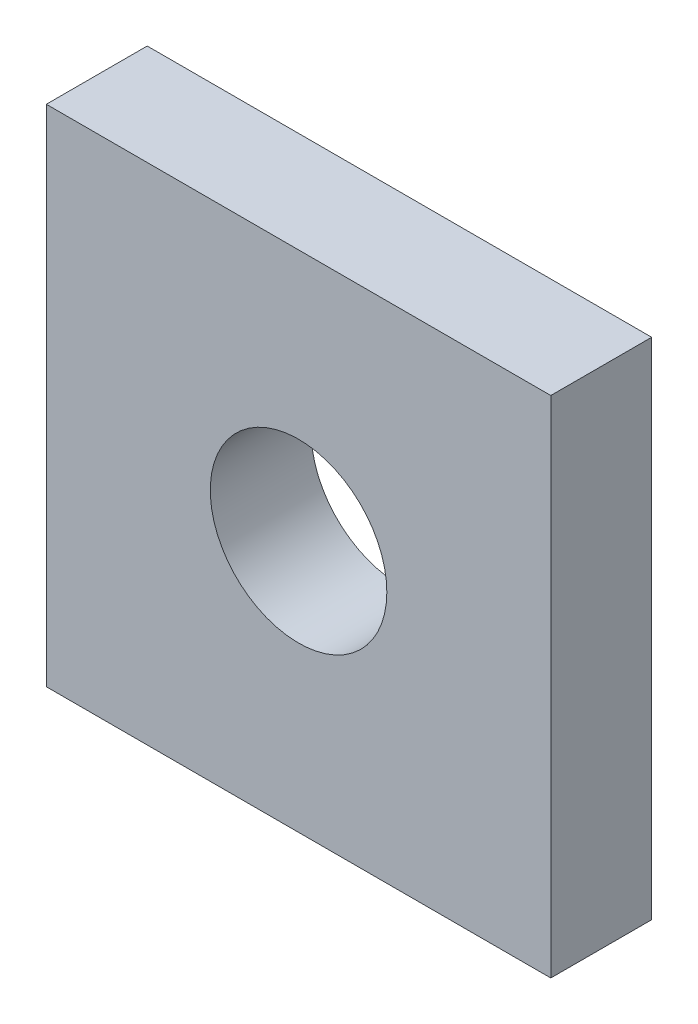
ISO-10303-21;
HEADER;
FILE_DESCRIPTION(('STEP AP214'),'2;1');
FILE_NAME('part.step','',(''),(''),'','','');
FILE_SCHEMA(('AUTOMOTIVE_DESIGN { 1 0 10303 214 1 1 1 1 }'));
ENDSEC;
DATA;
#1=APPLICATION_CONTEXT('core data for automotive mechanical design processes');
#2=APPLICATION_PROTOCOL_DEFINITION('international standard','automotive_design',2000,#1);
#3=PRODUCT_CONTEXT('',#1,'mechanical');
#4=PRODUCT('Part','Part','',(#3));
#5=PRODUCT_RELATED_PRODUCT_CATEGORY('part','',(#4));
#6=PRODUCT_DEFINITION_FORMATION('','',#4);
#7=PRODUCT_DEFINITION_CONTEXT('part definition',#1,'design');
#8=PRODUCT_DEFINITION('design','',#6,#7);
#9=PRODUCT_DEFINITION_SHAPE('','',#8);
#10=(LENGTH_UNIT() NAMED_UNIT(*) SI_UNIT(.MILLI.,.METRE.));
#11=(NAMED_UNIT(*) PLANE_ANGLE_UNIT() SI_UNIT($,.RADIAN.));
#12=(NAMED_UNIT(*) SI_UNIT($,.STERADIAN.) SOLID_ANGLE_UNIT());
#13=UNCERTAINTY_MEASURE_WITH_UNIT(LENGTH_MEASURE(1.E-05),#10,'distance_accuracy_value','');
#14=(GEOMETRIC_REPRESENTATION_CONTEXT(3) GLOBAL_UNCERTAINTY_ASSIGNED_CONTEXT((#13)) GLOBAL_UNIT_ASSIGNED_CONTEXT((#10,
#11,#12)) REPRESENTATION_CONTEXT('',''));
#15=CARTESIAN_POINT('',(0.,0.,0.));
#16=DIRECTION('',(0.,0.,1.));
#17=DIRECTION('',(1.,0.,0.));
#18=AXIS2_PLACEMENT_3D('',#15,#16,#17);
#19=CARTESIAN_POINT('',(0.,0.,10.));
#20=DIRECTION('',(0.,0.,-1.));
#21=DIRECTION('',(-1.,0.,0.));
#22=AXIS2_PLACEMENT_3D('',#19,#20,#21);
#23=PLANE('',#22);
#24=DIRECTION('',(0.,1.,0.));
#25=VECTOR('',#24,1.);
#26=CARTESIAN_POINT('',(25.,-25.,10.));
#27=LINE('',#26,#25);
#28=CARTESIAN_POINT('',(25.,-25.,10.));
#29=VERTEX_POINT('',#28);
#30=CARTESIAN_POINT('',(25.,25.,10.));
#31=VERTEX_POINT('',#30);
#32=EDGE_CURVE('E92',#29,#31,#27,.T.);
#33=ORIENTED_EDGE('',*,*,#32,.T.);
#34=DIRECTION('',(-1.,0.,0.));
#35=VECTOR('',#34,1.);
#36=CARTESIAN_POINT('',(-25.,25.,10.));
#37=LINE('',#36,#35);
#38=CARTESIAN_POINT('',(-25.,25.,10.));
#39=VERTEX_POINT('',#38);
#40=EDGE_CURVE('E87',#31,#39,#37,.T.);
#41=ORIENTED_EDGE('',*,*,#40,.T.);
#42=DIRECTION('',(0.,-1.,0.));
#43=VECTOR('',#42,1.);
#44=CARTESIAN_POINT('',(-25.,-25.,10.));
#45=LINE('',#44,#43);
#46=CARTESIAN_POINT('',(-25.,-25.,10.));
#47=VERTEX_POINT('',#46);
#48=EDGE_CURVE('E90',#39,#47,#45,.T.);
#49=ORIENTED_EDGE('',*,*,#48,.T.);
#50=DIRECTION('',(1.,0.,0.));
#51=VECTOR('',#50,1.);
#52=CARTESIAN_POINT('',(-25.,-25.,10.));
#53=LINE('',#52,#51);
#54=EDGE_CURVE('E57',#47,#29,#53,.T.);
#55=ORIENTED_EDGE('',*,*,#54,.T.);
#56=EDGE_LOOP('',(#33,#41,#49,#55));
#57=FACE_BOUND('',#56,.T.);
#58=CARTESIAN_POINT('',(0.,0.,10.));
#59=DIRECTION('',(0.,0.,1.));
#60=DIRECTION('',(1.,0.,0.));
#61=AXIS2_PLACEMENT_3D('',#58,#59,#60);
#62=CIRCLE('',#61,8.75);
#63=CARTESIAN_POINT('',(8.75,0.,10.));
#64=VERTEX_POINT('',#63);
#65=EDGE_CURVE('E112',#64,#64,#62,.T.);
#66=ORIENTED_EDGE('',*,*,#65,.F.);
#67=EDGE_LOOP('',(#66));
#68=FACE_BOUND('',#67,.T.);
#69=ADVANCED_FACE('F39',(#57,#68),#23,.F.);
#70=CARTESIAN_POINT('',(0.,0.,0.));
#71=DIRECTION('',(0.,0.,-1.));
#72=DIRECTION('',(-1.,0.,0.));
#73=AXIS2_PLACEMENT_3D('',#70,#71,#72);
#74=PLANE('',#73);
#75=DIRECTION('',(0.,1.,0.));
#76=VECTOR('',#75,1.);
#77=CARTESIAN_POINT('',(25.,-25.,0.));
#78=LINE('',#77,#76);
#79=CARTESIAN_POINT('',(25.,-25.,0.));
#80=VERTEX_POINT('',#79);
#81=CARTESIAN_POINT('',(25.,25.,0.));
#82=VERTEX_POINT('',#81);
#83=EDGE_CURVE('E108',#80,#82,#78,.T.);
#84=ORIENTED_EDGE('',*,*,#83,.F.);
#85=DIRECTION('',(1.,0.,0.));
#86=VECTOR('',#85,1.);
#87=CARTESIAN_POINT('',(-25.,-25.,0.));
#88=LINE('',#87,#86);
#89=CARTESIAN_POINT('',(-25.,-25.,0.));
#90=VERTEX_POINT('',#89);
#91=EDGE_CURVE('E80',#90,#80,#88,.T.);
#92=ORIENTED_EDGE('',*,*,#91,.F.);
#93=DIRECTION('',(0.,-1.,0.));
#94=VECTOR('',#93,1.);
#95=CARTESIAN_POINT('',(-25.,-25.,0.));
#96=LINE('',#95,#94);
#97=CARTESIAN_POINT('',(-25.,25.,0.));
#98=VERTEX_POINT('',#97);
#99=EDGE_CURVE('E74',#98,#90,#96,.T.);
#100=ORIENTED_EDGE('',*,*,#99,.F.);
#101=DIRECTION('',(-1.,0.,0.));
#102=VECTOR('',#101,1.);
#103=CARTESIAN_POINT('',(-25.,25.,0.));
#104=LINE('',#103,#102);
#105=EDGE_CURVE('E97',#82,#98,#104,.T.);
#106=ORIENTED_EDGE('',*,*,#105,.F.);
#107=EDGE_LOOP('',(#84,#92,#100,#106));
#108=FACE_BOUND('',#107,.T.);
#109=CARTESIAN_POINT('',(0.,0.,0.));
#110=DIRECTION('',(0.,0.,1.));
#111=DIRECTION('',(1.,0.,0.));
#112=AXIS2_PLACEMENT_3D('',#109,#110,#111);
#113=CIRCLE('',#112,8.75);
#114=CARTESIAN_POINT('',(8.75,0.,0.));
#115=VERTEX_POINT('',#114);
#116=EDGE_CURVE('E130',#115,#115,#113,.T.);
#117=ORIENTED_EDGE('',*,*,#116,.T.);
#118=EDGE_LOOP('',(#117));
#119=FACE_BOUND('',#118,.T.);
#120=ADVANCED_FACE('F125',(#108,#119),#74,.T.);
#121=CARTESIAN_POINT('',(25.,-25.,10.));
#122=DIRECTION('',(-1.,0.,0.));
#123=DIRECTION('',(0.,0.,1.));
#124=AXIS2_PLACEMENT_3D('',#121,#122,#123);
#125=PLANE('',#124);
#126=ORIENTED_EDGE('',*,*,#83,.T.);
#127=DIRECTION('',(0.,0.,-1.));
#128=VECTOR('',#127,1.);
#129=CARTESIAN_POINT('',(25.,25.,10.));
#130=LINE('',#129,#128);
#131=EDGE_CURVE('E11',#31,#82,#130,.T.);
#132=ORIENTED_EDGE('',*,*,#131,.F.);
#133=ORIENTED_EDGE('',*,*,#32,.F.);
#134=DIRECTION('',(0.,0.,-1.));
#135=VECTOR('',#134,1.);
#136=CARTESIAN_POINT('',(25.,-25.,10.));
#137=LINE('',#136,#135);
#138=EDGE_CURVE('E104',#29,#80,#137,.T.);
#139=ORIENTED_EDGE('',*,*,#138,.T.);
#140=EDGE_LOOP('',(#126,#132,#133,#139));
#141=FACE_BOUND('',#140,.T.);
#142=ADVANCED_FACE('F41',(#141),#125,.F.);
#143=CARTESIAN_POINT('',(-25.,25.,10.));
#144=DIRECTION('',(0.,-1.,0.));
#145=DIRECTION('',(0.,0.,-1.));
#146=AXIS2_PLACEMENT_3D('',#143,#144,#145);
#147=PLANE('',#146);
#148=ORIENTED_EDGE('',*,*,#105,.T.);
#149=DIRECTION('',(0.,0.,-1.));
#150=VECTOR('',#149,1.);
#151=CARTESIAN_POINT('',(-25.,25.,10.));
#152=LINE('',#151,#150);
#153=EDGE_CURVE('E49',#39,#98,#152,.T.);
#154=ORIENTED_EDGE('',*,*,#153,.F.);
#155=ORIENTED_EDGE('',*,*,#40,.F.);
#156=ORIENTED_EDGE('',*,*,#131,.T.);
#157=EDGE_LOOP('',(#148,#154,#155,#156));
#158=FACE_BOUND('',#157,.T.);
#159=ADVANCED_FACE('F96',(#158),#147,.F.);
#160=CARTESIAN_POINT('',(-25.,-25.,10.));
#161=DIRECTION('',(1.,0.,0.));
#162=DIRECTION('',(0.,0.,-1.));
#163=AXIS2_PLACEMENT_3D('',#160,#161,#162);
#164=PLANE('',#163);
#165=ORIENTED_EDGE('',*,*,#99,.T.);
#166=DIRECTION('',(0.,0.,-1.));
#167=VECTOR('',#166,1.);
#168=CARTESIAN_POINT('',(-25.,-25.,10.));
#169=LINE('',#168,#167);
#170=EDGE_CURVE('E99',#47,#90,#169,.T.);
#171=ORIENTED_EDGE('',*,*,#170,.F.);
#172=ORIENTED_EDGE('',*,*,#48,.F.);
#173=ORIENTED_EDGE('',*,*,#153,.T.);
#174=EDGE_LOOP('',(#165,#171,#172,#173));
#175=FACE_BOUND('',#174,.T.);
#176=ADVANCED_FACE('F100',(#175),#164,.F.);
#177=CARTESIAN_POINT('',(-25.,-25.,10.));
#178=DIRECTION('',(0.,1.,0.));
#179=DIRECTION('',(0.,0.,1.));
#180=AXIS2_PLACEMENT_3D('',#177,#178,#179);
#181=PLANE('',#180);
#182=ORIENTED_EDGE('',*,*,#91,.T.);
#183=ORIENTED_EDGE('',*,*,#138,.F.);
#184=ORIENTED_EDGE('',*,*,#54,.F.);
#185=ORIENTED_EDGE('',*,*,#170,.T.);
#186=EDGE_LOOP('',(#182,#183,#184,#185));
#187=FACE_BOUND('',#186,.T.);
#188=ADVANCED_FACE('F122',(#187),#181,.F.);
#189=CARTESIAN_POINT('',(0.,0.,10.));
#190=DIRECTION('',(0.,0.,-1.));
#191=DIRECTION('',(-1.,0.,0.));
#192=AXIS2_PLACEMENT_3D('',#189,#190,#191);
#193=CYLINDRICAL_SURFACE('',#192,8.75);
#194=ORIENTED_EDGE('',*,*,#65,.T.);
#195=EDGE_LOOP('',(#194));
#196=FACE_BOUND('',#195,.T.);
#197=ORIENTED_EDGE('',*,*,#116,.F.);
#198=EDGE_LOOP('',(#197));
#199=FACE_BOUND('',#198,.T.);
#200=ADVANCED_FACE('F138',(#196,#199),#193,.F.);
#201=CLOSED_SHELL('',(#69,#120,#142,#159,#176,#188,#200));
#202=MANIFOLD_SOLID_BREP('B2',#201);
#203=ADVANCED_BREP_SHAPE_REPRESENTATION('',(#18,#202),#14);
#204=SHAPE_DEFINITION_REPRESENTATION(#9,#203);
ENDSEC;
END-ISO-10303-21;
